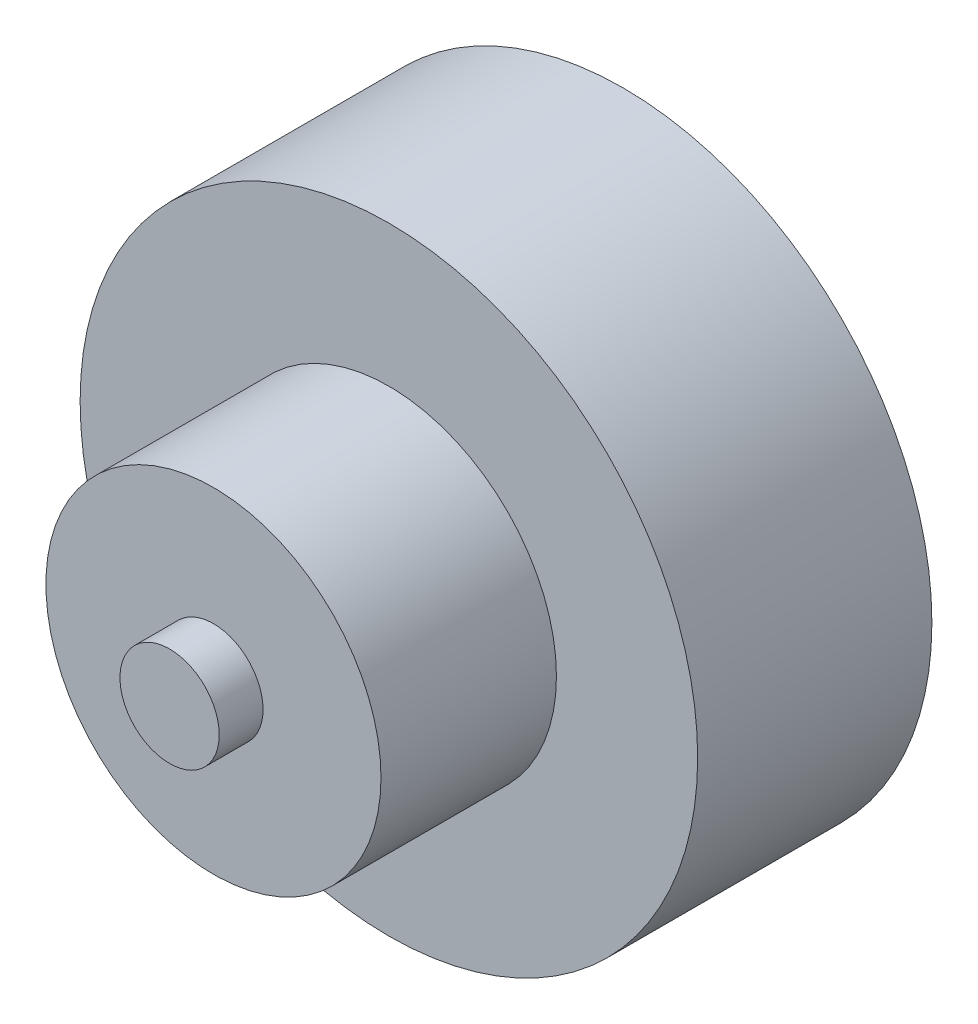
ISO-10303-21;
HEADER;
FILE_DESCRIPTION(('STEP AP214'),'2;1');
FILE_NAME('part.step','',(''),(''),'','','');
FILE_SCHEMA(('AUTOMOTIVE_DESIGN { 1 0 10303 214 1 1 1 1 }'));
ENDSEC;
DATA;
#1=APPLICATION_CONTEXT('core data for automotive mechanical design processes');
#2=APPLICATION_PROTOCOL_DEFINITION('international standard','automotive_design',2000,#1);
#3=PRODUCT_CONTEXT('',#1,'mechanical');
#4=PRODUCT('Part','Part','',(#3));
#5=PRODUCT_RELATED_PRODUCT_CATEGORY('part','',(#4));
#6=PRODUCT_DEFINITION_FORMATION('','',#4);
#7=PRODUCT_DEFINITION_CONTEXT('part definition',#1,'design');
#8=PRODUCT_DEFINITION('design','',#6,#7);
#9=PRODUCT_DEFINITION_SHAPE('','',#8);
#10=(LENGTH_UNIT() NAMED_UNIT(*) SI_UNIT(.MILLI.,.METRE.));
#11=(NAMED_UNIT(*) PLANE_ANGLE_UNIT() SI_UNIT($,.RADIAN.));
#12=(NAMED_UNIT(*) SI_UNIT($,.STERADIAN.) SOLID_ANGLE_UNIT());
#13=UNCERTAINTY_MEASURE_WITH_UNIT(LENGTH_MEASURE(1.E-05),#10,'distance_accuracy_value','');
#14=(GEOMETRIC_REPRESENTATION_CONTEXT(3) GLOBAL_UNCERTAINTY_ASSIGNED_CONTEXT((#13)) GLOBAL_UNIT_ASSIGNED_CONTEXT((#10,
#11,#12)) REPRESENTATION_CONTEXT('',''));
#15=CARTESIAN_POINT('',(0.,0.,0.));
#16=DIRECTION('',(0.,0.,1.));
#17=DIRECTION('',(1.,0.,0.));
#18=AXIS2_PLACEMENT_3D('',#15,#16,#17);
#19=CARTESIAN_POINT('',(0.,0.,0.));
#20=DIRECTION('',(0.,0.,1.));
#21=DIRECTION('',(1.,0.,0.));
#22=AXIS2_PLACEMENT_3D('',#19,#20,#21);
#23=PLANE('',#22);
#24=CARTESIAN_POINT('',(0.,0.,0.));
#25=DIRECTION('',(0.,0.,1.));
#26=DIRECTION('',(1.,0.,0.));
#27=AXIS2_PLACEMENT_3D('',#24,#25,#26);
#28=CIRCLE('',#27,35.56);
#29=CARTESIAN_POINT('',(35.56,0.,0.));
#30=VERTEX_POINT('',#29);
#31=EDGE_CURVE('E47',#30,#30,#28,.F.);
#32=ORIENTED_EDGE('',*,*,#31,.F.);
#33=EDGE_LOOP('',(#32));
#34=FACE_BOUND('',#33,.T.);
#35=CARTESIAN_POINT('',(0.,0.,0.));
#36=DIRECTION('',(0.,0.,1.));
#37=DIRECTION('',(1.,0.,0.));
#38=AXIS2_PLACEMENT_3D('',#35,#36,#37);
#39=CIRCLE('',#38,44.704);
#40=CARTESIAN_POINT('',(44.704,0.,0.));
#41=VERTEX_POINT('',#40);
#42=EDGE_CURVE('E12',#41,#41,#39,.T.);
#43=ORIENTED_EDGE('',*,*,#42,.F.);
#44=EDGE_LOOP('',(#43));
#45=FACE_BOUND('',#44,.T.);
#46=ADVANCED_FACE('F44',(#34,#45),#23,.F.);
#47=CARTESIAN_POINT('',(0.,0.,0.));
#48=DIRECTION('',(0.,0.,1.));
#49=DIRECTION('',(1.,0.,0.));
#50=AXIS2_PLACEMENT_3D('',#47,#48,#49);
#51=CYLINDRICAL_SURFACE('',#50,44.704);
#52=CARTESIAN_POINT('',(0.,0.,33.909));
#53=DIRECTION('',(0.,0.,1.));
#54=DIRECTION('',(1.,0.,0.));
#55=AXIS2_PLACEMENT_3D('',#52,#53,#54);
#56=CIRCLE('',#55,44.704);
#57=CARTESIAN_POINT('',(44.704,0.,33.909));
#58=VERTEX_POINT('',#57);
#59=EDGE_CURVE('E51',#58,#58,#56,.T.);
#60=ORIENTED_EDGE('',*,*,#59,.F.);
#61=EDGE_LOOP('',(#60));
#62=FACE_BOUND('',#61,.T.);
#63=ORIENTED_EDGE('',*,*,#42,.T.);
#64=EDGE_LOOP('',(#63));
#65=FACE_BOUND('',#64,.T.);
#66=ADVANCED_FACE('F77',(#62,#65),#51,.T.);
#67=CARTESIAN_POINT('',(0.,44.704,33.909));
#68=DIRECTION('',(0.,0.,-1.));
#69=DIRECTION('',(-1.,0.,0.));
#70=AXIS2_PLACEMENT_3D('',#67,#68,#69);
#71=PLANE('',#70);
#72=CARTESIAN_POINT('',(0.,0.,33.909));
#73=DIRECTION('',(0.,0.,1.));
#74=DIRECTION('',(1.,0.,0.));
#75=AXIS2_PLACEMENT_3D('',#72,#73,#74);
#76=CIRCLE('',#75,24.257);
#77=CARTESIAN_POINT('',(24.257,0.,33.909));
#78=VERTEX_POINT('',#77);
#79=EDGE_CURVE('E55',#78,#78,#76,.T.);
#80=ORIENTED_EDGE('',*,*,#79,.F.);
#81=EDGE_LOOP('',(#80));
#82=FACE_BOUND('',#81,.T.);
#83=ORIENTED_EDGE('',*,*,#59,.T.);
#84=EDGE_LOOP('',(#83));
#85=FACE_BOUND('',#84,.T.);
#86=ADVANCED_FACE('F81',(#82,#85),#71,.F.);
#87=CARTESIAN_POINT('',(0.,0.,0.));
#88=DIRECTION('',(0.,0.,1.));
#89=DIRECTION('',(1.,0.,0.));
#90=AXIS2_PLACEMENT_3D('',#87,#88,#89);
#91=CYLINDRICAL_SURFACE('',#90,24.257);
#92=CARTESIAN_POINT('',(0.,0.,59.309));
#93=DIRECTION('',(0.,0.,1.));
#94=DIRECTION('',(1.,0.,0.));
#95=AXIS2_PLACEMENT_3D('',#92,#93,#94);
#96=CIRCLE('',#95,24.257);
#97=CARTESIAN_POINT('',(24.257,0.,59.309));
#98=VERTEX_POINT('',#97);
#99=EDGE_CURVE('E60',#98,#98,#96,.T.);
#100=ORIENTED_EDGE('',*,*,#99,.F.);
#101=EDGE_LOOP('',(#100));
#102=FACE_BOUND('',#101,.T.);
#103=ORIENTED_EDGE('',*,*,#79,.T.);
#104=EDGE_LOOP('',(#103));
#105=FACE_BOUND('',#104,.T.);
#106=ADVANCED_FACE('F86',(#102,#105),#91,.T.);
#107=CARTESIAN_POINT('',(0.,24.257,59.309));
#108=DIRECTION('',(0.,0.,-1.));
#109=DIRECTION('',(-1.,0.,0.));
#110=AXIS2_PLACEMENT_3D('',#107,#108,#109);
#111=PLANE('',#110);
#112=CARTESIAN_POINT('',(0.,0.,59.309));
#113=DIRECTION('',(0.,0.,1.));
#114=DIRECTION('',(1.,0.,0.));
#115=AXIS2_PLACEMENT_3D('',#112,#113,#114);
#116=CIRCLE('',#115,7.18245008837452);
#117=CARTESIAN_POINT('',(7.18245008837452,0.,59.309));
#118=VERTEX_POINT('',#117);
#119=EDGE_CURVE('E63',#118,#118,#116,.T.);
#120=ORIENTED_EDGE('',*,*,#119,.F.);
#121=EDGE_LOOP('',(#120));
#122=FACE_BOUND('',#121,.T.);
#123=ORIENTED_EDGE('',*,*,#99,.T.);
#124=EDGE_LOOP('',(#123));
#125=FACE_BOUND('',#124,.T.);
#126=ADVANCED_FACE('F93',(#122,#125),#111,.F.);
#127=CARTESIAN_POINT('',(0.,0.,0.));
#128=DIRECTION('',(0.,0.,1.));
#129=DIRECTION('',(1.,0.,0.));
#130=AXIS2_PLACEMENT_3D('',#127,#128,#129);
#131=CYLINDRICAL_SURFACE('',#130,7.18245008837452);
#132=CARTESIAN_POINT('',(0.,0.,65.659));
#133=DIRECTION('',(0.,0.,1.));
#134=DIRECTION('',(1.,0.,0.));
#135=AXIS2_PLACEMENT_3D('',#132,#133,#134);
#136=CIRCLE('',#135,7.18245008837451);
#137=CARTESIAN_POINT('',(7.18245008837451,0.,65.659));
#138=VERTEX_POINT('',#137);
#139=EDGE_CURVE('E66',#138,#138,#136,.T.);
#140=ORIENTED_EDGE('',*,*,#139,.F.);
#141=EDGE_LOOP('',(#140));
#142=FACE_BOUND('',#141,.T.);
#143=ORIENTED_EDGE('',*,*,#119,.T.);
#144=EDGE_LOOP('',(#143));
#145=FACE_BOUND('',#144,.T.);
#146=ADVANCED_FACE('F97',(#142,#145),#131,.T.);
#147=CARTESIAN_POINT('',(0.,7.18245008837451,65.659));
#148=DIRECTION('',(0.,0.,-1.));
#149=DIRECTION('',(-1.,0.,0.));
#150=AXIS2_PLACEMENT_3D('',#147,#148,#149);
#151=PLANE('',#150);
#152=ORIENTED_EDGE('',*,*,#139,.T.);
#153=EDGE_LOOP('',(#152));
#154=FACE_BOUND('',#153,.T.);
#155=ADVANCED_FACE('F101',(#154),#151,.F.);
#156=CARTESIAN_POINT('',(0.,0.,-121.92));
#157=DIRECTION('',(0.,0.,1.));
#158=DIRECTION('',(0.,1.,0.));
#159=AXIS2_PLACEMENT_3D('',#156,#157,#158);
#160=SPHERICAL_SURFACE('',#159,127.);
#161=ORIENTED_EDGE('',*,*,#31,.T.);
#162=EDGE_LOOP('',(#161));
#163=FACE_BOUND('',#162,.T.);
#164=ADVANCED_FACE('F73',(#163),#160,.F.);
#165=CLOSED_SHELL('',(#46,#66,#86,#106,#126,#146,#155,#164));
#166=MANIFOLD_SOLID_BREP('B2',#165);
#167=ADVANCED_BREP_SHAPE_REPRESENTATION('',(#18,#166),#14);
#168=SHAPE_DEFINITION_REPRESENTATION(#9,#167);
ENDSEC;
END-ISO-10303-21;
